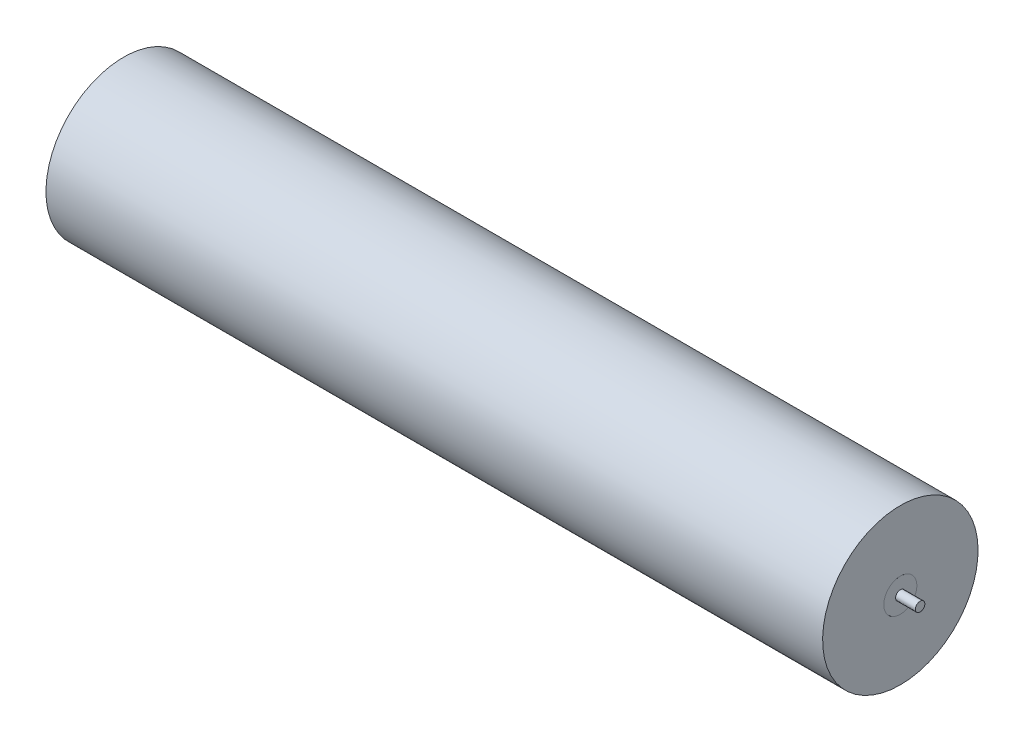
ISO-10303-21;
HEADER;
FILE_DESCRIPTION(('STEP AP214'),'2;1');
FILE_NAME('part.step','',(''),(''),'','','');
FILE_SCHEMA(('AUTOMOTIVE_DESIGN { 1 0 10303 214 1 1 1 1 }'));
ENDSEC;
DATA;
#1=APPLICATION_CONTEXT('core data for automotive mechanical design processes');
#2=APPLICATION_PROTOCOL_DEFINITION('international standard','automotive_design',2000,#1);
#3=PRODUCT_CONTEXT('',#1,'mechanical');
#4=PRODUCT('Part','Part','',(#3));
#5=PRODUCT_RELATED_PRODUCT_CATEGORY('part','',(#4));
#6=PRODUCT_DEFINITION_FORMATION('','',#4);
#7=PRODUCT_DEFINITION_CONTEXT('part definition',#1,'design');
#8=PRODUCT_DEFINITION('design','',#6,#7);
#9=PRODUCT_DEFINITION_SHAPE('','',#8);
#10=(LENGTH_UNIT() NAMED_UNIT(*) SI_UNIT(.MILLI.,.METRE.));
#11=(NAMED_UNIT(*) PLANE_ANGLE_UNIT() SI_UNIT($,.RADIAN.));
#12=(NAMED_UNIT(*) SI_UNIT($,.STERADIAN.) SOLID_ANGLE_UNIT());
#13=UNCERTAINTY_MEASURE_WITH_UNIT(LENGTH_MEASURE(1.E-05),#10,'distance_accuracy_value','');
#14=(GEOMETRIC_REPRESENTATION_CONTEXT(3) GLOBAL_UNCERTAINTY_ASSIGNED_CONTEXT((#13)) GLOBAL_UNIT_ASSIGNED_CONTEXT((#10,
#11,#12)) REPRESENTATION_CONTEXT('',''));
#15=CARTESIAN_POINT('',(0.,0.,0.));
#16=DIRECTION('',(0.,0.,1.));
#17=DIRECTION('',(1.,0.,0.));
#18=AXIS2_PLACEMENT_3D('',#15,#16,#17);
#19=CARTESIAN_POINT('',(-866.5,9.99999999999981,0.));
#20=DIRECTION('',(1.,0.,0.));
#21=DIRECTION('',(0.,1.,0.));
#22=AXIS2_PLACEMENT_3D('',#19,#20,#21);
#23=PLANE('',#22);
#24=CARTESIAN_POINT('',(-866.5,-2.12231290292236E-13,0.));
#25=DIRECTION('',(-1.,0.,0.));
#26=DIRECTION('',(0.,-1.,0.));
#27=AXIS2_PLACEMENT_3D('',#24,#25,#26);
#28=CIRCLE('',#27,10.);
#29=CARTESIAN_POINT('',(-866.5,-10.0000000000002,0.));
#30=VERTEX_POINT('',#29);
#31=EDGE_CURVE('E46',#30,#30,#28,.T.);
#32=ORIENTED_EDGE('',*,*,#31,.T.);
#33=EDGE_LOOP('',(#32));
#34=FACE_BOUND('',#33,.T.);
#35=ADVANCED_FACE('F40',(#34),#23,.F.);
#36=CARTESIAN_POINT('',(866.5,10.0000000000004,0.));
#37=DIRECTION('',(-1.,0.,0.));
#38=DIRECTION('',(0.,-1.,0.));
#39=AXIS2_PLACEMENT_3D('',#36,#37,#38);
#40=PLANE('',#39);
#41=CARTESIAN_POINT('',(866.5,2.12231290292236E-13,0.));
#42=DIRECTION('',(-1.,0.,0.));
#43=DIRECTION('',(0.,-1.,0.));
#44=AXIS2_PLACEMENT_3D('',#41,#42,#43);
#45=CIRCLE('',#44,10.0000000000002);
#46=CARTESIAN_POINT('',(866.5,-10.,0.));
#47=VERTEX_POINT('',#46);
#48=EDGE_CURVE('E11',#47,#47,#45,.T.);
#49=ORIENTED_EDGE('',*,*,#48,.F.);
#50=EDGE_LOOP('',(#49));
#51=FACE_BOUND('',#50,.T.);
#52=ADVANCED_FACE('F55',(#51),#40,.F.);
#53=CARTESIAN_POINT('',(-866.5,-2.12231290292236E-13,0.));
#54=DIRECTION('',(-1.,0.,0.));
#55=DIRECTION('',(0.,-1.,0.));
#56=AXIS2_PLACEMENT_3D('',#53,#54,#55);
#57=CYLINDRICAL_SURFACE('',#56,10.0000000000001);
#58=ORIENTED_EDGE('',*,*,#31,.F.);
#59=EDGE_LOOP('',(#58));
#60=FACE_BOUND('',#59,.T.);
#61=ORIENTED_EDGE('',*,*,#48,.T.);
#62=EDGE_LOOP('',(#61));
#63=FACE_BOUND('',#62,.T.);
#64=ADVANCED_FACE('F53',(#60,#63),#57,.T.);
#65=CLOSED_SHELL('',(#35,#52,#64));
#66=MANIFOLD_SOLID_BREP('B2',#65);
#67=CARTESIAN_POINT('',(814.5,2.07678697362758E-13,0.));
#68=DIRECTION('',(1.,0.,0.));
#69=DIRECTION('',(0.,1.,0.));
#70=AXIS2_PLACEMENT_3D('',#67,#68,#69);
#71=CYLINDRICAL_SURFACE('',#70,35.1);
#72=CARTESIAN_POINT('',(814.5,2.07678697362758E-13,0.));
#73=DIRECTION('',(1.,0.,0.));
#74=DIRECTION('',(0.,1.,0.));
#75=AXIS2_PLACEMENT_3D('',#72,#73,#74);
#76=CIRCLE('',#75,35.1);
#77=CARTESIAN_POINT('',(814.5,35.1000000000002,0.));
#78=VERTEX_POINT('',#77);
#79=EDGE_CURVE('E39',#78,#78,#76,.T.);
#80=ORIENTED_EDGE('',*,*,#79,.T.);
#81=EDGE_LOOP('',(#80));
#82=FACE_BOUND('',#81,.T.);
#83=CARTESIAN_POINT('',(824.5,2.09626294381453E-13,0.));
#84=DIRECTION('',(1.,0.,0.));
#85=DIRECTION('',(0.,1.,0.));
#86=AXIS2_PLACEMENT_3D('',#83,#84,#85);
#87=CIRCLE('',#86,35.1);
#88=CARTESIAN_POINT('',(824.5,35.1000000000002,0.));
#89=VERTEX_POINT('',#88);
#90=EDGE_CURVE('E92',#89,#89,#87,.T.);
#91=ORIENTED_EDGE('',*,*,#90,.F.);
#92=EDGE_LOOP('',(#91));
#93=FACE_BOUND('',#92,.T.);
#94=ADVANCED_FACE('F89',(#82,#93),#71,.T.);
#95=CARTESIAN_POINT('',(814.5,2.07678697362758E-13,0.));
#96=DIRECTION('',(1.,0.,0.));
#97=DIRECTION('',(0.,1.,0.));
#98=AXIS2_PLACEMENT_3D('',#95,#96,#97);
#99=PLANE('',#98);
#100=CARTESIAN_POINT('',(814.5,2.07678697362758E-13,0.));
#101=DIRECTION('',(1.,0.,0.));
#102=DIRECTION('',(0.,1.,0.));
#103=AXIS2_PLACEMENT_3D('',#100,#101,#102);
#104=CIRCLE('',#103,10.0005);
#105=CARTESIAN_POINT('',(814.5,10.0005000000002,0.));
#106=VERTEX_POINT('',#105);
#107=EDGE_CURVE('E99',#106,#106,#104,.T.);
#108=ORIENTED_EDGE('',*,*,#107,.T.);
#109=EDGE_LOOP('',(#108));
#110=FACE_BOUND('',#109,.T.);
#111=ORIENTED_EDGE('',*,*,#79,.F.);
#112=EDGE_LOOP('',(#111));
#113=FACE_BOUND('',#112,.T.);
#114=ADVANCED_FACE('F107',(#110,#113),#99,.F.);
#115=CARTESIAN_POINT('',(824.5,2.09626294381453E-13,0.));
#116=DIRECTION('',(1.,0.,0.));
#117=DIRECTION('',(0.,1.,0.));
#118=AXIS2_PLACEMENT_3D('',#115,#116,#117);
#119=PLANE('',#118);
#120=CARTESIAN_POINT('',(824.5,2.09626294381453E-13,0.));
#121=DIRECTION('',(1.,0.,0.));
#122=DIRECTION('',(0.,1.,0.));
#123=AXIS2_PLACEMENT_3D('',#120,#121,#122);
#124=CIRCLE('',#123,10.0005);
#125=CARTESIAN_POINT('',(824.5,10.0005000000002,0.));
#126=VERTEX_POINT('',#125);
#127=EDGE_CURVE('E101',#126,#126,#124,.T.);
#128=ORIENTED_EDGE('',*,*,#127,.F.);
#129=EDGE_LOOP('',(#128));
#130=FACE_BOUND('',#129,.T.);
#131=ORIENTED_EDGE('',*,*,#90,.T.);
#132=EDGE_LOOP('',(#131));
#133=FACE_BOUND('',#132,.T.);
#134=ADVANCED_FACE('F113',(#130,#133),#119,.T.);
#135=CARTESIAN_POINT('',(814.5,2.07678697362758E-13,0.));
#136=DIRECTION('',(1.,0.,0.));
#137=DIRECTION('',(0.,1.,0.));
#138=AXIS2_PLACEMENT_3D('',#135,#136,#137);
#139=CYLINDRICAL_SURFACE('',#138,10.0005);
#140=ORIENTED_EDGE('',*,*,#107,.F.);
#141=EDGE_LOOP('',(#140));
#142=FACE_BOUND('',#141,.T.);
#143=ORIENTED_EDGE('',*,*,#127,.T.);
#144=EDGE_LOOP('',(#143));
#145=FACE_BOUND('',#144,.T.);
#146=ADVANCED_FACE('F110',(#142,#145),#139,.F.);
#147=CLOSED_SHELL('',(#94,#114,#134,#146));
#148=MANIFOLD_SOLID_BREP('B6',#147);
#149=CARTESIAN_POINT('',(-814.5,-1.09584856982612E-13,0.));
#150=DIRECTION('',(-1.,0.,0.));
#151=DIRECTION('',(0.,-1.,0.));
#152=AXIS2_PLACEMENT_3D('',#149,#150,#151);
#153=CYLINDRICAL_SURFACE('',#152,35.1);
#154=CARTESIAN_POINT('',(-814.5,-1.09584856982612E-13,0.));
#155=DIRECTION('',(-1.,0.,0.));
#156=DIRECTION('',(0.,-1.,0.));
#157=AXIS2_PLACEMENT_3D('',#154,#155,#156);
#158=CIRCLE('',#157,35.1);
#159=CARTESIAN_POINT('',(-814.5,-35.1000000000001,0.));
#160=VERTEX_POINT('',#159);
#161=EDGE_CURVE('E88',#160,#160,#158,.T.);
#162=ORIENTED_EDGE('',*,*,#161,.T.);
#163=EDGE_LOOP('',(#162));
#164=FACE_BOUND('',#163,.T.);
#165=CARTESIAN_POINT('',(-824.5,-1.11532454001307E-13,0.));
#166=DIRECTION('',(-1.,0.,0.));
#167=DIRECTION('',(0.,-1.,0.));
#168=AXIS2_PLACEMENT_3D('',#165,#166,#167);
#169=CIRCLE('',#168,35.1);
#170=CARTESIAN_POINT('',(-824.5,-35.1000000000001,0.));
#171=VERTEX_POINT('',#170);
#172=EDGE_CURVE('E161',#171,#171,#169,.T.);
#173=ORIENTED_EDGE('',*,*,#172,.F.);
#174=EDGE_LOOP('',(#173));
#175=FACE_BOUND('',#174,.T.);
#176=ADVANCED_FACE('F158',(#164,#175),#153,.T.);
#177=CARTESIAN_POINT('',(-814.5,-1.09584856982612E-13,0.));
#178=DIRECTION('',(-1.,0.,0.));
#179=DIRECTION('',(0.,-1.,0.));
#180=AXIS2_PLACEMENT_3D('',#177,#178,#179);
#181=PLANE('',#180);
#182=CARTESIAN_POINT('',(-814.5,-1.09584856982612E-13,0.));
#183=DIRECTION('',(-1.,0.,0.));
#184=DIRECTION('',(0.,-1.,0.));
#185=AXIS2_PLACEMENT_3D('',#182,#183,#184);
#186=CIRCLE('',#185,10.0005);
#187=CARTESIAN_POINT('',(-814.5,-10.0005000000001,0.));
#188=VERTEX_POINT('',#187);
#189=EDGE_CURVE('E168',#188,#188,#186,.T.);
#190=ORIENTED_EDGE('',*,*,#189,.T.);
#191=EDGE_LOOP('',(#190));
#192=FACE_BOUND('',#191,.T.);
#193=ORIENTED_EDGE('',*,*,#161,.F.);
#194=EDGE_LOOP('',(#193));
#195=FACE_BOUND('',#194,.T.);
#196=ADVANCED_FACE('F176',(#192,#195),#181,.F.);
#197=CARTESIAN_POINT('',(-824.5,-1.11532454001307E-13,0.));
#198=DIRECTION('',(-1.,0.,0.));
#199=DIRECTION('',(0.,-1.,0.));
#200=AXIS2_PLACEMENT_3D('',#197,#198,#199);
#201=PLANE('',#200);
#202=CARTESIAN_POINT('',(-824.5,-1.11532454001307E-13,0.));
#203=DIRECTION('',(-1.,0.,0.));
#204=DIRECTION('',(0.,-1.,0.));
#205=AXIS2_PLACEMENT_3D('',#202,#203,#204);
#206=CIRCLE('',#205,10.0005);
#207=CARTESIAN_POINT('',(-824.5,-10.0005000000001,0.));
#208=VERTEX_POINT('',#207);
#209=EDGE_CURVE('E170',#208,#208,#206,.T.);
#210=ORIENTED_EDGE('',*,*,#209,.F.);
#211=EDGE_LOOP('',(#210));
#212=FACE_BOUND('',#211,.T.);
#213=ORIENTED_EDGE('',*,*,#172,.T.);
#214=EDGE_LOOP('',(#213));
#215=FACE_BOUND('',#214,.T.);
#216=ADVANCED_FACE('F182',(#212,#215),#201,.T.);
#217=CARTESIAN_POINT('',(-814.5,-1.09584856982612E-13,0.));
#218=DIRECTION('',(-1.,0.,0.));
#219=DIRECTION('',(0.,-1.,0.));
#220=AXIS2_PLACEMENT_3D('',#217,#218,#219);
#221=CYLINDRICAL_SURFACE('',#220,10.0005);
#222=ORIENTED_EDGE('',*,*,#189,.F.);
#223=EDGE_LOOP('',(#222));
#224=FACE_BOUND('',#223,.T.);
#225=ORIENTED_EDGE('',*,*,#209,.T.);
#226=EDGE_LOOP('',(#225));
#227=FACE_BOUND('',#226,.T.);
#228=ADVANCED_FACE('F179',(#224,#227),#221,.F.);
#229=CLOSED_SHELL('',(#176,#196,#216,#228));
#230=MANIFOLD_SOLID_BREP('B34',#229);
#231=CARTESIAN_POINT('',(-824.5,35.1004999999998,0.));
#232=DIRECTION('',(1.,0.,0.));
#233=DIRECTION('',(0.,1.,0.));
#234=AXIS2_PLACEMENT_3D('',#231,#232,#233);
#235=PLANE('',#234);
#236=CARTESIAN_POINT('',(-824.5,0.,0.));
#237=DIRECTION('',(-1.,0.,0.));
#238=DIRECTION('',(0.,-1.,0.));
#239=AXIS2_PLACEMENT_3D('',#236,#237,#238);
#240=CIRCLE('',#239,35.1004999999998);
#241=CARTESIAN_POINT('',(-824.5,-35.1004999999998,0.));
#242=VERTEX_POINT('',#241);
#243=EDGE_CURVE('E234',#242,#242,#240,.T.);
#244=ORIENTED_EDGE('',*,*,#243,.F.);
#245=EDGE_LOOP('',(#244));
#246=FACE_BOUND('',#245,.T.);
#247=CARTESIAN_POINT('',(-824.5,0.,0.));
#248=DIRECTION('',(-1.,0.,0.));
#249=DIRECTION('',(0.,-1.,0.));
#250=AXIS2_PLACEMENT_3D('',#247,#248,#249);
#251=CIRCLE('',#250,165.);
#252=CARTESIAN_POINT('',(-824.5,-165.,0.));
#253=VERTEX_POINT('',#252);
#254=EDGE_CURVE('E157',#253,#253,#251,.T.);
#255=ORIENTED_EDGE('',*,*,#254,.T.);
#256=EDGE_LOOP('',(#255));
#257=FACE_BOUND('',#256,.T.);
#258=ADVANCED_FACE('F220',(#246,#257),#235,.F.);
#259=CARTESIAN_POINT('',(-824.5,0.,0.));
#260=DIRECTION('',(-1.,0.,0.));
#261=DIRECTION('',(0.,-1.,0.));
#262=AXIS2_PLACEMENT_3D('',#259,#260,#261);
#263=CYLINDRICAL_SURFACE('',#262,165.);
#264=ORIENTED_EDGE('',*,*,#254,.F.);
#265=EDGE_LOOP('',(#264));
#266=FACE_BOUND('',#265,.T.);
#267=CARTESIAN_POINT('',(824.5,3.02916385769098E-13,0.));
#268=DIRECTION('',(-1.,0.,0.));
#269=DIRECTION('',(0.,-1.,0.));
#270=AXIS2_PLACEMENT_3D('',#267,#268,#269);
#271=CIRCLE('',#270,165.);
#272=CARTESIAN_POINT('',(824.5,-165.,0.));
#273=VERTEX_POINT('',#272);
#274=EDGE_CURVE('E226',#273,#273,#271,.T.);
#275=ORIENTED_EDGE('',*,*,#274,.T.);
#276=EDGE_LOOP('',(#275));
#277=FACE_BOUND('',#276,.T.);
#278=ADVANCED_FACE('F243',(#266,#277),#263,.T.);
#279=CARTESIAN_POINT('',(824.5,165.,0.));
#280=DIRECTION('',(-1.,0.,0.));
#281=DIRECTION('',(0.,-1.,0.));
#282=AXIS2_PLACEMENT_3D('',#279,#280,#281);
#283=PLANE('',#282);
#284=ORIENTED_EDGE('',*,*,#274,.F.);
#285=EDGE_LOOP('',(#284));
#286=FACE_BOUND('',#285,.T.);
#287=CARTESIAN_POINT('',(824.5,3.02916385769098E-13,0.));
#288=DIRECTION('',(-1.,0.,0.));
#289=DIRECTION('',(0.,-1.,0.));
#290=AXIS2_PLACEMENT_3D('',#287,#288,#289);
#291=CIRCLE('',#290,35.1004999999998);
#292=CARTESIAN_POINT('',(824.5,-35.1004999999995,0.));
#293=VERTEX_POINT('',#292);
#294=EDGE_CURVE('E230',#293,#293,#291,.T.);
#295=ORIENTED_EDGE('',*,*,#294,.T.);
#296=EDGE_LOOP('',(#295));
#297=FACE_BOUND('',#296,.T.);
#298=ADVANCED_FACE('F247',(#286,#297),#283,.F.);
#299=CARTESIAN_POINT('',(-824.5,0.,0.));
#300=DIRECTION('',(-1.,0.,0.));
#301=DIRECTION('',(0.,-1.,0.));
#302=AXIS2_PLACEMENT_3D('',#299,#300,#301);
#303=CYLINDRICAL_SURFACE('',#302,35.1004999999998);
#304=ORIENTED_EDGE('',*,*,#294,.F.);
#305=EDGE_LOOP('',(#304));
#306=FACE_BOUND('',#305,.T.);
#307=ORIENTED_EDGE('',*,*,#243,.T.);
#308=EDGE_LOOP('',(#307));
#309=FACE_BOUND('',#308,.T.);
#310=ADVANCED_FACE('F240',(#306,#309),#303,.F.);
#311=CLOSED_SHELL('',(#258,#278,#298,#310));
#312=MANIFOLD_SOLID_BREP('B83',#311);
#313=ADVANCED_BREP_SHAPE_REPRESENTATION('',(#18,#66,#148,#230,#312),#14);
#314=SHAPE_DEFINITION_REPRESENTATION(#9,#313);
ENDSEC;
END-ISO-10303-21;
